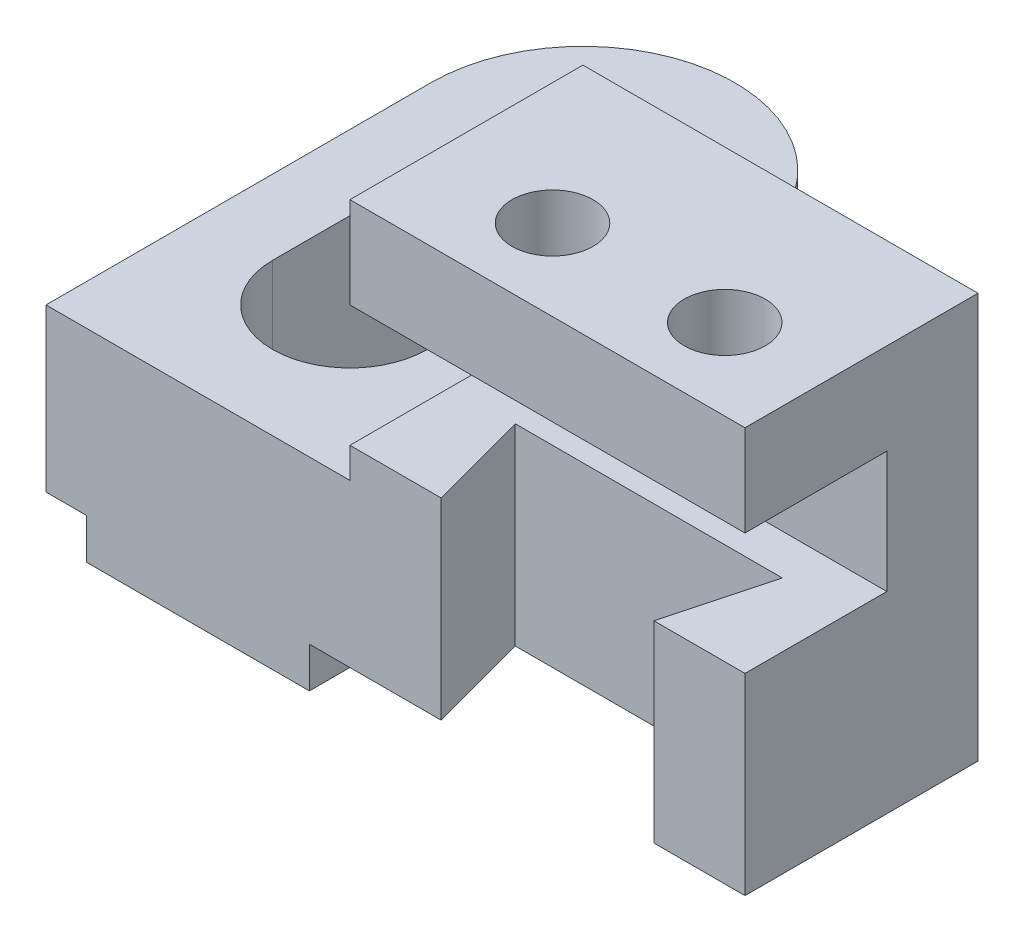
ISO-10303-21;
HEADER;
FILE_DESCRIPTION(('STEP AP214'),'2;1');
FILE_NAME('part.step','',(''),(''),'','','');
FILE_SCHEMA(('AUTOMOTIVE_DESIGN { 1 0 10303 214 1 1 1 1 }'));
ENDSEC;
DATA;
#1=APPLICATION_CONTEXT('core data for automotive mechanical design processes');
#2=APPLICATION_PROTOCOL_DEFINITION('international standard','automotive_design',2000,#1);
#3=PRODUCT_CONTEXT('',#1,'mechanical');
#4=PRODUCT('Part','Part','',(#3));
#5=PRODUCT_RELATED_PRODUCT_CATEGORY('part','',(#4));
#6=PRODUCT_DEFINITION_FORMATION('','',#4);
#7=PRODUCT_DEFINITION_CONTEXT('part definition',#1,'design');
#8=PRODUCT_DEFINITION('design','',#6,#7);
#9=PRODUCT_DEFINITION_SHAPE('','',#8);
#10=(LENGTH_UNIT() NAMED_UNIT(*) SI_UNIT(.MILLI.,.METRE.));
#11=(NAMED_UNIT(*) PLANE_ANGLE_UNIT() SI_UNIT($,.RADIAN.));
#12=(NAMED_UNIT(*) SI_UNIT($,.STERADIAN.) SOLID_ANGLE_UNIT());
#13=UNCERTAINTY_MEASURE_WITH_UNIT(LENGTH_MEASURE(1.E-05),#10,'distance_accuracy_value','');
#14=(GEOMETRIC_REPRESENTATION_CONTEXT(3) GLOBAL_UNCERTAINTY_ASSIGNED_CONTEXT((#13)) GLOBAL_UNIT_ASSIGNED_CONTEXT((#10,
#11,#12)) REPRESENTATION_CONTEXT('',''));
#15=CARTESIAN_POINT('',(0.,0.,0.));
#16=DIRECTION('',(0.,0.,1.));
#17=DIRECTION('',(1.,0.,0.));
#18=AXIS2_PLACEMENT_3D('',#15,#16,#17);
#19=CARTESIAN_POINT('',(0.,-16.,0.));
#20=DIRECTION('',(0.,1.,0.));
#21=DIRECTION('',(0.,0.,1.));
#22=AXIS2_PLACEMENT_3D('',#19,#20,#21);
#23=PLANE('',#22);
#24=DIRECTION('',(0.,0.,1.));
#25=VECTOR('',#24,1.);
#26=CARTESIAN_POINT('',(-7.63079742439027,-16.,0.));
#27=LINE('',#26,#25);
#28=CARTESIAN_POINT('',(-7.63079742439027,-16.,-43.4109870829268));
#29=VERTEX_POINT('',#28);
#30=CARTESIAN_POINT('',(-7.63079742439027,-16.,-20.4109870829268));
#31=VERTEX_POINT('',#30);
#32=EDGE_CURVE('E330',#29,#31,#27,.T.);
#33=ORIENTED_EDGE('',*,*,#32,.T.);
#34=CARTESIAN_POINT('',(0.,-16.,-20.4109870829268));
#35=DIRECTION('',(0.,1.,0.));
#36=DIRECTION('',(0.,0.,1.));
#37=AXIS2_PLACEMENT_3D('',#34,#35,#36);
#38=CIRCLE('',#37,7.63079742439027);
#39=CARTESIAN_POINT('',(7.63079742439027,-16.,-20.4109870829268));
#40=VERTEX_POINT('',#39);
#41=EDGE_CURVE('E339',#31,#40,#38,.T.);
#42=ORIENTED_EDGE('',*,*,#41,.T.);
#43=DIRECTION('',(0.,0.,1.));
#44=VECTOR('',#43,1.);
#45=CARTESIAN_POINT('',(7.63079742439027,-16.,0.));
#46=LINE('',#45,#44);
#47=CARTESIAN_POINT('',(7.63079742439027,-16.,-43.4109870829268));
#48=VERTEX_POINT('',#47);
#49=EDGE_CURVE('E336',#48,#40,#46,.T.);
#50=ORIENTED_EDGE('',*,*,#49,.F.);
#51=CARTESIAN_POINT('',(0.,-16.,-43.4109870829268));
#52=DIRECTION('',(0.,1.,0.));
#53=DIRECTION('',(0.,0.,1.));
#54=AXIS2_PLACEMENT_3D('',#51,#52,#53);
#55=CIRCLE('',#54,7.63079742439027);
#56=EDGE_CURVE('E333',#48,#29,#55,.T.);
#57=ORIENTED_EDGE('',*,*,#56,.T.);
#58=EDGE_LOOP('',(#33,#42,#50,#57));
#59=FACE_BOUND('',#58,.T.);
#60=DIRECTION('',(0.,0.,1.));
#61=VECTOR('',#60,1.);
#62=CARTESIAN_POINT('',(11.,-16.,-10.4109870829268));
#63=LINE('',#62,#61);
#64=CARTESIAN_POINT('',(11.,-16.,-10.4109870829268));
#65=VERTEX_POINT('',#64);
#66=CARTESIAN_POINT('',(11.,-16.,-5.41098708292683));
#67=VERTEX_POINT('',#66);
#68=EDGE_CURVE('E231',#65,#67,#63,.T.);
#69=ORIENTED_EDGE('',*,*,#68,.F.);
#70=DIRECTION('',(-1.,0.,0.));
#71=VECTOR('',#70,1.);
#72=CARTESIAN_POINT('',(-11.,-16.,-10.4109870829268));
#73=LINE('',#72,#71);
#74=CARTESIAN_POINT('',(-11.,-16.,-10.4109870829268));
#75=VERTEX_POINT('',#74);
#76=EDGE_CURVE('E208',#65,#75,#73,.T.);
#77=ORIENTED_EDGE('',*,*,#76,.T.);
#78=DIRECTION('',(0.,0.,1.));
#79=VECTOR('',#78,1.);
#80=CARTESIAN_POINT('',(-11.,-16.,-10.4109870829268));
#81=LINE('',#80,#79);
#82=CARTESIAN_POINT('',(-11.,-16.,-5.41098708292682));
#83=VERTEX_POINT('',#82);
#84=EDGE_CURVE('E220',#75,#83,#81,.T.);
#85=ORIENTED_EDGE('',*,*,#84,.T.);
#86=DIRECTION('',(1.,0.,0.));
#87=VECTOR('',#86,1.);
#88=CARTESIAN_POINT('',(0.,-16.,-5.41098708292683));
#89=LINE('',#88,#87);
#90=CARTESIAN_POINT('',(-15.,-16.,-5.41098708292682));
#91=VERTEX_POINT('',#90);
#92=EDGE_CURVE('E347',#91,#83,#89,.T.);
#93=ORIENTED_EDGE('',*,*,#92,.F.);
#94=DIRECTION('',(0.,0.,-1.));
#95=VECTOR('',#94,1.);
#96=CARTESIAN_POINT('',(-15.,-16.,0.));
#97=LINE('',#96,#95);
#98=CARTESIAN_POINT('',(-15.,-16.,-43.4109870829268));
#99=VERTEX_POINT('',#98);
#100=EDGE_CURVE('E344',#91,#99,#97,.T.);
#101=ORIENTED_EDGE('',*,*,#100,.T.);
#102=CARTESIAN_POINT('',(0.,-16.,-43.4109870829268));
#103=DIRECTION('',(0.,1.,0.));
#104=DIRECTION('',(0.,0.,1.));
#105=AXIS2_PLACEMENT_3D('',#102,#103,#104);
#106=CIRCLE('',#105,15.);
#107=CARTESIAN_POINT('',(15.,-16.,-43.4109870829268));
#108=VERTEX_POINT('',#107);
#109=EDGE_CURVE('E341',#99,#108,#106,.F.);
#110=ORIENTED_EDGE('',*,*,#109,.T.);
#111=DIRECTION('',(0.,0.,-1.));
#112=VECTOR('',#111,1.);
#113=CARTESIAN_POINT('',(15.,-16.,0.));
#114=LINE('',#113,#112);
#115=CARTESIAN_POINT('',(15.,-16.,-28.4109870829268));
#116=VERTEX_POINT('',#115);
#117=EDGE_CURVE('E350',#116,#108,#114,.T.);
#118=ORIENTED_EDGE('',*,*,#117,.F.);
#119=DIRECTION('',(1.,0.,0.));
#120=VECTOR('',#119,1.);
#121=CARTESIAN_POINT('',(54.,-16.,-28.4109870829268));
#122=LINE('',#121,#120);
#123=CARTESIAN_POINT('',(54.,-16.,-28.4109870829268));
#124=VERTEX_POINT('',#123);
#125=EDGE_CURVE('E320',#116,#124,#122,.T.);
#126=ORIENTED_EDGE('',*,*,#125,.T.);
#127=DIRECTION('',(0.,0.,1.));
#128=VECTOR('',#127,1.);
#129=CARTESIAN_POINT('',(54.,-16.,-28.4109870829268));
#130=LINE('',#129,#128);
#131=CARTESIAN_POINT('',(54.,-16.,-5.41098708292683));
#132=VERTEX_POINT('',#131);
#133=EDGE_CURVE('E325',#124,#132,#130,.T.);
#134=ORIENTED_EDGE('',*,*,#133,.T.);
#135=CARTESIAN_POINT('',(45.,-16.,-5.41098708292684));
#136=VERTEX_POINT('',#135);
#137=EDGE_CURVE('E346',#136,#132,#89,.T.);
#138=ORIENTED_EDGE('',*,*,#137,.F.);
#139=DIRECTION('',(-0.258819045102525,0.,0.965925826289067));
#140=VECTOR('',#139,1.);
#141=CARTESIAN_POINT('',(40.6328248144181,-16.,10.8875325952188));
#142=LINE('',#141,#140);
#143=CARTESIAN_POINT('',(47.6794919243113,-16.,-15.4109870829268));
#144=VERTEX_POINT('',#143);
#145=EDGE_CURVE('E254',#144,#136,#142,.T.);
#146=ORIENTED_EDGE('',*,*,#145,.F.);
#147=DIRECTION('',(1.,0.,0.));
#148=VECTOR('',#147,1.);
#149=CARTESIAN_POINT('',(0.,-16.,-15.4109870829268));
#150=LINE('',#149,#148);
#151=CARTESIAN_POINT('',(21.3205080756887,-16.,-15.4109870829268));
#152=VERTEX_POINT('',#151);
#153=EDGE_CURVE('E244',#152,#144,#150,.T.);
#154=ORIENTED_EDGE('',*,*,#153,.F.);
#155=DIRECTION('',(-0.258819045102525,0.,-0.965925826289067));
#156=VECTOR('',#155,1.);
#157=CARTESIAN_POINT('',(23.745051616145,-16.,-6.36246740478147));
#158=LINE('',#157,#156);
#159=CARTESIAN_POINT('',(24.,-16.,-5.41098708292683));
#160=VERTEX_POINT('',#159);
#161=EDGE_CURVE('E252',#160,#152,#158,.T.);
#162=ORIENTED_EDGE('',*,*,#161,.F.);
#163=EDGE_CURVE('E351',#67,#160,#89,.T.);
#164=ORIENTED_EDGE('',*,*,#163,.F.);
#165=EDGE_LOOP('',(#69,#77,#85,#93,#101,#110,#118,#126,#134,#138,#146,#154,#162,#164));
#166=FACE_BOUND('',#165,.T.);
#167=ADVANCED_FACE('F39',(#59,#166),#23,.F.);
#168=CARTESIAN_POINT('',(0.,-16.,-5.41098708292683));
#169=DIRECTION('',(0.,0.,1.));
#170=DIRECTION('',(1.,0.,0.));
#171=AXIS2_PLACEMENT_3D('',#168,#169,#170);
#172=PLANE('',#171);
#173=DIRECTION('',(-1.,0.,0.));
#174=VECTOR('',#173,1.);
#175=CARTESIAN_POINT('',(54.,3.,-5.41098708292684));
#176=LINE('',#175,#174);
#177=CARTESIAN_POINT('',(54.,3.,-5.41098708292684));
#178=VERTEX_POINT('',#177);
#179=CARTESIAN_POINT('',(45.,3.,-5.41098708292684));
#180=VERTEX_POINT('',#179);
#181=EDGE_CURVE('E298',#178,#180,#176,.T.);
#182=ORIENTED_EDGE('',*,*,#181,.T.);
#183=DIRECTION('',(0.,1.,0.));
#184=VECTOR('',#183,1.);
#185=CARTESIAN_POINT('',(45.,-20.,-5.41098708292684));
#186=LINE('',#185,#184);
#187=EDGE_CURVE('E242',#136,#180,#186,.T.);
#188=ORIENTED_EDGE('',*,*,#187,.F.);
#189=ORIENTED_EDGE('',*,*,#137,.T.);
#190=DIRECTION('',(0.,1.,0.));
#191=VECTOR('',#190,1.);
#192=CARTESIAN_POINT('',(54.,0.,-5.41098708292683));
#193=LINE('',#192,#191);
#194=EDGE_CURVE('E316',#132,#178,#193,.T.);
#195=ORIENTED_EDGE('',*,*,#194,.T.);
#196=EDGE_LOOP('',(#182,#188,#189,#195));
#197=FACE_BOUND('',#196,.T.);
#198=ADVANCED_FACE('F414',(#197),#172,.T.);
#199=ORIENTED_EDGE('',*,*,#92,.T.);
#200=DIRECTION('',(0.,-1.,0.));
#201=VECTOR('',#200,1.);
#202=CARTESIAN_POINT('',(-11.,-20.,-5.41098708292683));
#203=LINE('',#202,#201);
#204=CARTESIAN_POINT('',(-11.,-20.,-5.41098708292683));
#205=VERTEX_POINT('',#204);
#206=EDGE_CURVE('E56',#83,#205,#203,.T.);
#207=ORIENTED_EDGE('',*,*,#206,.T.);
#208=DIRECTION('',(1.,0.,0.));
#209=VECTOR('',#208,1.);
#210=CARTESIAN_POINT('',(11.,-20.,-5.41098708292683));
#211=LINE('',#210,#209);
#212=CARTESIAN_POINT('',(11.,-20.,-5.41098708292683));
#213=VERTEX_POINT('',#212);
#214=EDGE_CURVE('E205',#205,#213,#211,.T.);
#215=ORIENTED_EDGE('',*,*,#214,.T.);
#216=DIRECTION('',(0.,1.,0.));
#217=VECTOR('',#216,1.);
#218=CARTESIAN_POINT('',(11.,-16.,-5.41098708292683));
#219=LINE('',#218,#217);
#220=EDGE_CURVE('E221',#213,#67,#219,.T.);
#221=ORIENTED_EDGE('',*,*,#220,.T.);
#222=ORIENTED_EDGE('',*,*,#163,.T.);
#223=DIRECTION('',(0.,1.,0.));
#224=VECTOR('',#223,1.);
#225=CARTESIAN_POINT('',(24.,-20.,-5.41098708292683));
#226=LINE('',#225,#224);
#227=CARTESIAN_POINT('',(24.,3.,-5.41098708292683));
#228=VERTEX_POINT('',#227);
#229=EDGE_CURVE('E245',#160,#228,#226,.T.);
#230=ORIENTED_EDGE('',*,*,#229,.T.);
#231=CARTESIAN_POINT('',(15.,3.,-5.41098708292683));
#232=VERTEX_POINT('',#231);
#233=EDGE_CURVE('E281',#228,#232,#176,.T.);
#234=ORIENTED_EDGE('',*,*,#233,.T.);
#235=DIRECTION('',(0.,-1.,0.));
#236=VECTOR('',#235,1.);
#237=CARTESIAN_POINT('',(15.,3.,-5.41098708292683));
#238=LINE('',#237,#236);
#239=CARTESIAN_POINT('',(15.,0.,-5.41098708292683));
#240=VERTEX_POINT('',#239);
#241=EDGE_CURVE('E272',#232,#240,#238,.T.);
#242=ORIENTED_EDGE('',*,*,#241,.T.);
#243=DIRECTION('',(1.,0.,0.));
#244=VECTOR('',#243,1.);
#245=CARTESIAN_POINT('',(0.,0.,-5.41098708292683));
#246=LINE('',#245,#244);
#247=CARTESIAN_POINT('',(-15.,0.,-5.41098708292682));
#248=VERTEX_POINT('',#247);
#249=EDGE_CURVE('E368',#248,#240,#246,.T.);
#250=ORIENTED_EDGE('',*,*,#249,.F.);
#251=DIRECTION('',(0.,1.,0.));
#252=VECTOR('',#251,1.);
#253=CARTESIAN_POINT('',(-15.,-16.,-5.41098708292682));
#254=LINE('',#253,#252);
#255=EDGE_CURVE('E48',#91,#248,#254,.T.);
#256=ORIENTED_EDGE('',*,*,#255,.F.);
#257=EDGE_LOOP('',(#199,#207,#215,#221,#222,#230,#234,#242,#250,#256));
#258=FACE_BOUND('',#257,.T.);
#259=ADVANCED_FACE('F419',(#258),#172,.T.);
#260=CARTESIAN_POINT('',(54.,3.,-19.4109870829268));
#261=DIRECTION('',(0.,-1.,0.));
#262=DIRECTION('',(0.,0.,-1.));
#263=AXIS2_PLACEMENT_3D('',#260,#261,#262);
#264=PLANE('',#263);
#265=DIRECTION('',(-0.258819045102525,0.,0.965925826289067));
#266=VECTOR('',#265,1.);
#267=CARTESIAN_POINT('',(40.632824814418,3.,10.8875325952188));
#268=LINE('',#267,#266);
#269=CARTESIAN_POINT('',(47.6794919243113,3.,-15.4109870829268));
#270=VERTEX_POINT('',#269);
#271=EDGE_CURVE('E64',#270,#180,#268,.T.);
#272=ORIENTED_EDGE('',*,*,#271,.T.);
#273=ORIENTED_EDGE('',*,*,#181,.F.);
#274=DIRECTION('',(0.,0.,1.));
#275=VECTOR('',#274,1.);
#276=CARTESIAN_POINT('',(54.,3.,-19.4109870829268));
#277=LINE('',#276,#275);
#278=CARTESIAN_POINT('',(54.,3.,-19.4109870829268));
#279=VERTEX_POINT('',#278);
#280=EDGE_CURVE('E278',#279,#178,#277,.T.);
#281=ORIENTED_EDGE('',*,*,#280,.F.);
#282=DIRECTION('',(-1.,0.,0.));
#283=VECTOR('',#282,1.);
#284=CARTESIAN_POINT('',(54.,3.,-19.4109870829268));
#285=LINE('',#284,#283);
#286=CARTESIAN_POINT('',(15.,3.,-19.4109870829268));
#287=VERTEX_POINT('',#286);
#288=EDGE_CURVE('E301',#279,#287,#285,.T.);
#289=ORIENTED_EDGE('',*,*,#288,.T.);
#290=DIRECTION('',(0.,0.,1.));
#291=VECTOR('',#290,1.);
#292=CARTESIAN_POINT('',(15.,3.,-19.4109870829268));
#293=LINE('',#292,#291);
#294=EDGE_CURVE('E294',#287,#232,#293,.T.);
#295=ORIENTED_EDGE('',*,*,#294,.T.);
#296=ORIENTED_EDGE('',*,*,#233,.F.);
#297=DIRECTION('',(-0.258819045102525,0.,-0.965925826289067));
#298=VECTOR('',#297,1.);
#299=CARTESIAN_POINT('',(23.745051616145,3.,-6.36246740478147));
#300=LINE('',#299,#298);
#301=CARTESIAN_POINT('',(21.3205080756887,3.,-15.4109870829268));
#302=VERTEX_POINT('',#301);
#303=EDGE_CURVE('E238',#228,#302,#300,.T.);
#304=ORIENTED_EDGE('',*,*,#303,.T.);
#305=DIRECTION('',(1.,0.,0.));
#306=VECTOR('',#305,1.);
#307=CARTESIAN_POINT('',(0.,3.,-15.4109870829268));
#308=LINE('',#307,#306);
#309=EDGE_CURVE('E235',#302,#270,#308,.T.);
#310=ORIENTED_EDGE('',*,*,#309,.T.);
#311=EDGE_LOOP('',(#272,#273,#281,#289,#295,#296,#304,#310));
#312=FACE_BOUND('',#311,.T.);
#313=ADVANCED_FACE('F428',(#312),#264,.F.);
#314=CARTESIAN_POINT('',(0.,0.,0.));
#315=DIRECTION('',(0.,1.,0.));
#316=DIRECTION('',(0.,0.,1.));
#317=AXIS2_PLACEMENT_3D('',#314,#315,#316);
#318=PLANE('',#317);
#319=DIRECTION('',(0.,0.,1.));
#320=VECTOR('',#319,1.);
#321=CARTESIAN_POINT('',(-7.63079742439027,0.,0.));
#322=LINE('',#321,#320);
#323=CARTESIAN_POINT('',(-7.63079742439027,0.,-43.4109870829268));
#324=VERTEX_POINT('',#323);
#325=CARTESIAN_POINT('',(-7.63079742439027,0.,-20.4109870829268));
#326=VERTEX_POINT('',#325);
#327=EDGE_CURVE('E329',#324,#326,#322,.T.);
#328=ORIENTED_EDGE('',*,*,#327,.F.);
#329=CARTESIAN_POINT('',(0.,0.,-43.4109870829268));
#330=DIRECTION('',(0.,1.,0.));
#331=DIRECTION('',(0.,0.,1.));
#332=AXIS2_PLACEMENT_3D('',#329,#330,#331);
#333=CIRCLE('',#332,7.63079742439027);
#334=CARTESIAN_POINT('',(7.63079742439027,0.,-43.4109870829268));
#335=VERTEX_POINT('',#334);
#336=EDGE_CURVE('E355',#335,#324,#333,.T.);
#337=ORIENTED_EDGE('',*,*,#336,.F.);
#338=DIRECTION('',(0.,0.,1.));
#339=VECTOR('',#338,1.);
#340=CARTESIAN_POINT('',(7.63079742439027,0.,0.));
#341=LINE('',#340,#339);
#342=CARTESIAN_POINT('',(7.63079742439027,0.,-20.4109870829268));
#343=VERTEX_POINT('',#342);
#344=EDGE_CURVE('E357',#335,#343,#341,.T.);
#345=ORIENTED_EDGE('',*,*,#344,.T.);
#346=CARTESIAN_POINT('',(0.,0.,-20.4109870829268));
#347=DIRECTION('',(0.,1.,0.));
#348=DIRECTION('',(0.,0.,1.));
#349=AXIS2_PLACEMENT_3D('',#346,#347,#348);
#350=CIRCLE('',#349,7.63079742439027);
#351=EDGE_CURVE('E360',#326,#343,#350,.T.);
#352=ORIENTED_EDGE('',*,*,#351,.F.);
#353=EDGE_LOOP('',(#328,#337,#345,#352));
#354=FACE_BOUND('',#353,.T.);
#355=ORIENTED_EDGE('',*,*,#249,.T.);
#356=DIRECTION('',(0.,0.,-1.));
#357=VECTOR('',#356,1.);
#358=CARTESIAN_POINT('',(15.,0.,-28.4109870829268));
#359=LINE('',#358,#357);
#360=CARTESIAN_POINT('',(15.,0.,-28.4109870829268));
#361=VERTEX_POINT('',#360);
#362=EDGE_CURVE('E260',#240,#361,#359,.T.);
#363=ORIENTED_EDGE('',*,*,#362,.T.);
#364=DIRECTION('',(0.,0.,-1.));
#365=VECTOR('',#364,1.);
#366=CARTESIAN_POINT('',(15.,0.,0.));
#367=LINE('',#366,#365);
#368=CARTESIAN_POINT('',(15.,0.,-43.4109870829268));
#369=VERTEX_POINT('',#368);
#370=EDGE_CURVE('E334',#361,#369,#367,.T.);
#371=ORIENTED_EDGE('',*,*,#370,.T.);
#372=CARTESIAN_POINT('',(0.,0.,-43.4109870829268));
#373=DIRECTION('',(0.,1.,0.));
#374=DIRECTION('',(0.,0.,1.));
#375=AXIS2_PLACEMENT_3D('',#372,#373,#374);
#376=CIRCLE('',#375,15.);
#377=CARTESIAN_POINT('',(-15.,0.,-43.4109870829268));
#378=VERTEX_POINT('',#377);
#379=EDGE_CURVE('E363',#378,#369,#376,.F.);
#380=ORIENTED_EDGE('',*,*,#379,.F.);
#381=DIRECTION('',(0.,0.,-1.));
#382=VECTOR('',#381,1.);
#383=CARTESIAN_POINT('',(-15.,0.,0.));
#384=LINE('',#383,#382);
#385=EDGE_CURVE('E366',#248,#378,#384,.T.);
#386=ORIENTED_EDGE('',*,*,#385,.F.);
#387=EDGE_LOOP('',(#355,#363,#371,#380,#386));
#388=FACE_BOUND('',#387,.T.);
#389=ADVANCED_FACE('F391',(#354,#388),#318,.T.);
#390=CARTESIAN_POINT('',(0.,-16.,-43.4109870829268));
#391=DIRECTION('',(0.,1.,0.));
#392=DIRECTION('',(0.,0.,1.));
#393=AXIS2_PLACEMENT_3D('',#390,#391,#392);
#394=CYLINDRICAL_SURFACE('',#393,15.);
#395=ORIENTED_EDGE('',*,*,#379,.T.);
#396=DIRECTION('',(0.,1.,0.));
#397=VECTOR('',#396,1.);
#398=CARTESIAN_POINT('',(15.,-16.,-43.4109870829268));
#399=LINE('',#398,#397);
#400=EDGE_CURVE('E11',#108,#369,#399,.T.);
#401=ORIENTED_EDGE('',*,*,#400,.F.);
#402=ORIENTED_EDGE('',*,*,#109,.F.);
#403=DIRECTION('',(0.,1.,0.));
#404=VECTOR('',#403,1.);
#405=CARTESIAN_POINT('',(-15.,-16.,-43.4109870829268));
#406=LINE('',#405,#404);
#407=EDGE_CURVE('E373',#99,#378,#406,.T.);
#408=ORIENTED_EDGE('',*,*,#407,.T.);
#409=EDGE_LOOP('',(#395,#401,#402,#408));
#410=FACE_BOUND('',#409,.T.);
#411=ADVANCED_FACE('F427',(#410),#394,.T.);
#412=CARTESIAN_POINT('',(15.,-16.,0.));
#413=DIRECTION('',(1.,0.,0.));
#414=DIRECTION('',(0.,0.,-1.));
#415=AXIS2_PLACEMENT_3D('',#412,#413,#414);
#416=PLANE('',#415);
#417=DIRECTION('',(0.,-1.,0.));
#418=VECTOR('',#417,1.);
#419=CARTESIAN_POINT('',(15.,-16.,-28.4109870829268));
#420=LINE('',#419,#418);
#421=EDGE_CURVE('E317',#361,#116,#420,.T.);
#422=ORIENTED_EDGE('',*,*,#421,.T.);
#423=ORIENTED_EDGE('',*,*,#117,.T.);
#424=ORIENTED_EDGE('',*,*,#400,.T.);
#425=ORIENTED_EDGE('',*,*,#370,.F.);
#426=EDGE_LOOP('',(#422,#423,#424,#425));
#427=FACE_BOUND('',#426,.T.);
#428=ADVANCED_FACE('F429',(#427),#416,.T.);
#429=CARTESIAN_POINT('',(-7.63079742439027,-16.,0.));
#430=DIRECTION('',(-1.,0.,0.));
#431=DIRECTION('',(0.,0.,1.));
#432=AXIS2_PLACEMENT_3D('',#429,#430,#431);
#433=PLANE('',#432);
#434=ORIENTED_EDGE('',*,*,#327,.T.);
#435=DIRECTION('',(0.,1.,0.));
#436=VECTOR('',#435,1.);
#437=CARTESIAN_POINT('',(-7.63079742439027,-16.,-20.4109870829268));
#438=LINE('',#437,#436);
#439=EDGE_CURVE('E376',#31,#326,#438,.T.);
#440=ORIENTED_EDGE('',*,*,#439,.F.);
#441=ORIENTED_EDGE('',*,*,#32,.F.);
#442=DIRECTION('',(0.,1.,0.));
#443=VECTOR('',#442,1.);
#444=CARTESIAN_POINT('',(-7.63079742439027,-16.,-43.4109870829268));
#445=LINE('',#444,#443);
#446=EDGE_CURVE('E43',#29,#324,#445,.T.);
#447=ORIENTED_EDGE('',*,*,#446,.T.);
#448=EDGE_LOOP('',(#434,#440,#441,#447));
#449=FACE_BOUND('',#448,.T.);
#450=ADVANCED_FACE('F41',(#449),#433,.F.);
#451=CARTESIAN_POINT('',(0.,-16.,-20.4109870829268));
#452=DIRECTION('',(0.,1.,0.));
#453=DIRECTION('',(0.,0.,1.));
#454=AXIS2_PLACEMENT_3D('',#451,#452,#453);
#455=CYLINDRICAL_SURFACE('',#454,7.63079742439027);
#456=ORIENTED_EDGE('',*,*,#351,.T.);
#457=DIRECTION('',(0.,1.,0.));
#458=VECTOR('',#457,1.);
#459=CARTESIAN_POINT('',(7.63079742439027,-16.,-20.4109870829268));
#460=LINE('',#459,#458);
#461=EDGE_CURVE('E379',#40,#343,#460,.T.);
#462=ORIENTED_EDGE('',*,*,#461,.F.);
#463=ORIENTED_EDGE('',*,*,#41,.F.);
#464=ORIENTED_EDGE('',*,*,#439,.T.);
#465=EDGE_LOOP('',(#456,#462,#463,#464));
#466=FACE_BOUND('',#465,.T.);
#467=ADVANCED_FACE('F396',(#466),#455,.F.);
#468=CARTESIAN_POINT('',(7.63079742439027,-16.,0.));
#469=DIRECTION('',(-1.,0.,0.));
#470=DIRECTION('',(0.,0.,1.));
#471=AXIS2_PLACEMENT_3D('',#468,#469,#470);
#472=PLANE('',#471);
#473=ORIENTED_EDGE('',*,*,#344,.F.);
#474=DIRECTION('',(0.,1.,0.));
#475=VECTOR('',#474,1.);
#476=CARTESIAN_POINT('',(7.63079742439027,-16.,-43.4109870829268));
#477=LINE('',#476,#475);
#478=EDGE_CURVE('E380',#48,#335,#477,.T.);
#479=ORIENTED_EDGE('',*,*,#478,.F.);
#480=ORIENTED_EDGE('',*,*,#49,.T.);
#481=ORIENTED_EDGE('',*,*,#461,.T.);
#482=EDGE_LOOP('',(#473,#479,#480,#481));
#483=FACE_BOUND('',#482,.T.);
#484=ADVANCED_FACE('F403',(#483),#472,.T.);
#485=CARTESIAN_POINT('',(0.,-16.,-43.4109870829268));
#486=DIRECTION('',(0.,1.,0.));
#487=DIRECTION('',(0.,0.,1.));
#488=AXIS2_PLACEMENT_3D('',#485,#486,#487);
#489=CYLINDRICAL_SURFACE('',#488,7.63079742439027);
#490=ORIENTED_EDGE('',*,*,#336,.T.);
#491=ORIENTED_EDGE('',*,*,#446,.F.);
#492=ORIENTED_EDGE('',*,*,#56,.F.);
#493=ORIENTED_EDGE('',*,*,#478,.T.);
#494=EDGE_LOOP('',(#490,#491,#492,#493));
#495=FACE_BOUND('',#494,.T.);
#496=ADVANCED_FACE('F400',(#495),#489,.F.);
#497=CARTESIAN_POINT('',(-15.,-16.,0.));
#498=DIRECTION('',(1.,0.,0.));
#499=DIRECTION('',(0.,0.,-1.));
#500=AXIS2_PLACEMENT_3D('',#497,#498,#499);
#501=PLANE('',#500);
#502=ORIENTED_EDGE('',*,*,#385,.T.);
#503=ORIENTED_EDGE('',*,*,#407,.F.);
#504=ORIENTED_EDGE('',*,*,#100,.F.);
#505=ORIENTED_EDGE('',*,*,#255,.T.);
#506=EDGE_LOOP('',(#502,#503,#504,#505));
#507=FACE_BOUND('',#506,.T.);
#508=ADVANCED_FACE('F402',(#507),#501,.F.);
#509=CARTESIAN_POINT('',(54.,0.,-28.4109870829268));
#510=DIRECTION('',(1.,0.,0.));
#511=DIRECTION('',(0.,0.,-1.));
#512=AXIS2_PLACEMENT_3D('',#509,#510,#511);
#513=PLANE('',#512);
#514=ORIENTED_EDGE('',*,*,#194,.F.);
#515=ORIENTED_EDGE('',*,*,#133,.F.);
#516=DIRECTION('',(0.,1.,0.));
#517=VECTOR('',#516,1.);
#518=CARTESIAN_POINT('',(54.,0.,-28.4109870829268));
#519=LINE('',#518,#517);
#520=CARTESIAN_POINT('',(54.,24.,-28.4109870829268));
#521=VERTEX_POINT('',#520);
#522=EDGE_CURVE('E323',#124,#521,#519,.T.);
#523=ORIENTED_EDGE('',*,*,#522,.T.);
#524=DIRECTION('',(0.,0.,1.));
#525=VECTOR('',#524,1.);
#526=CARTESIAN_POINT('',(54.,24.,-5.41098708292684));
#527=LINE('',#526,#525);
#528=CARTESIAN_POINT('',(54.,24.,-5.41098708292684));
#529=VERTEX_POINT('',#528);
#530=EDGE_CURVE('E269',#521,#529,#527,.T.);
#531=ORIENTED_EDGE('',*,*,#530,.T.);
#532=DIRECTION('',(0.,-1.,0.));
#533=VECTOR('',#532,1.);
#534=CARTESIAN_POINT('',(54.,24.,-5.41098708292684));
#535=LINE('',#534,#533);
#536=CARTESIAN_POINT('',(54.,15.,-5.41098708292684));
#537=VERTEX_POINT('',#536);
#538=EDGE_CURVE('E271',#529,#537,#535,.T.);
#539=ORIENTED_EDGE('',*,*,#538,.T.);
#540=DIRECTION('',(0.,0.,-1.));
#541=VECTOR('',#540,1.);
#542=CARTESIAN_POINT('',(54.,15.,-5.41098708292684));
#543=LINE('',#542,#541);
#544=CARTESIAN_POINT('',(54.,15.,-19.4109870829268));
#545=VERTEX_POINT('',#544);
#546=EDGE_CURVE('E274',#537,#545,#543,.T.);
#547=ORIENTED_EDGE('',*,*,#546,.T.);
#548=DIRECTION('',(0.,-1.,0.));
#549=VECTOR('',#548,1.);
#550=CARTESIAN_POINT('',(54.,15.,-19.4109870829268));
#551=LINE('',#550,#549);
#552=EDGE_CURVE('E276',#545,#279,#551,.T.);
#553=ORIENTED_EDGE('',*,*,#552,.T.);
#554=ORIENTED_EDGE('',*,*,#280,.T.);
#555=EDGE_LOOP('',(#514,#515,#523,#531,#539,#547,#553,#554));
#556=FACE_BOUND('',#555,.T.);
#557=ADVANCED_FACE('F408',(#556),#513,.T.);
#558=CARTESIAN_POINT('',(0.,0.,-28.4109870829268));
#559=DIRECTION('',(0.,0.,-1.));
#560=DIRECTION('',(-1.,0.,0.));
#561=AXIS2_PLACEMENT_3D('',#558,#559,#560);
#562=PLANE('',#561);
#563=ORIENTED_EDGE('',*,*,#421,.F.);
#564=DIRECTION('',(0.,1.,0.));
#565=VECTOR('',#564,1.);
#566=CARTESIAN_POINT('',(15.,24.,-28.4109870829268));
#567=LINE('',#566,#565);
#568=CARTESIAN_POINT('',(15.,24.,-28.4109870829268));
#569=VERTEX_POINT('',#568);
#570=EDGE_CURVE('E284',#361,#569,#567,.T.);
#571=ORIENTED_EDGE('',*,*,#570,.T.);
#572=DIRECTION('',(-1.,0.,0.));
#573=VECTOR('',#572,1.);
#574=CARTESIAN_POINT('',(54.,24.,-28.4109870829268));
#575=LINE('',#574,#573);
#576=EDGE_CURVE('E313',#521,#569,#575,.T.);
#577=ORIENTED_EDGE('',*,*,#576,.F.);
#578=ORIENTED_EDGE('',*,*,#522,.F.);
#579=ORIENTED_EDGE('',*,*,#125,.F.);
#580=EDGE_LOOP('',(#563,#571,#577,#578,#579));
#581=FACE_BOUND('',#580,.T.);
#582=ADVANCED_FACE('F550',(#581),#562,.T.);
#583=CARTESIAN_POINT('',(54.,24.,-5.41098708292684));
#584=DIRECTION('',(0.,-1.,0.));
#585=DIRECTION('',(0.,0.,-1.));
#586=AXIS2_PLACEMENT_3D('',#583,#584,#585);
#587=PLANE('',#586);
#588=CARTESIAN_POINT('',(27.,24.,-13.4109870829268));
#589=DIRECTION('',(0.,1.,0.));
#590=DIRECTION('',(0.,0.,1.));
#591=AXIS2_PLACEMENT_3D('',#588,#589,#590);
#592=CIRCLE('',#591,4.);
#593=CARTESIAN_POINT('',(27.,24.,-9.41098708292684));
#594=VERTEX_POINT('',#593);
#595=EDGE_CURVE('E261',#594,#594,#592,.T.);
#596=ORIENTED_EDGE('',*,*,#595,.F.);
#597=EDGE_LOOP('',(#596));
#598=FACE_BOUND('',#597,.T.);
#599=CARTESIAN_POINT('',(44.,24.,-13.4109870829268));
#600=DIRECTION('',(0.,1.,0.));
#601=DIRECTION('',(0.,0.,1.));
#602=AXIS2_PLACEMENT_3D('',#599,#600,#601);
#603=CIRCLE('',#602,4.);
#604=CARTESIAN_POINT('',(44.,24.,-9.41098708292684));
#605=VERTEX_POINT('',#604);
#606=EDGE_CURVE('E264',#605,#605,#603,.T.);
#607=ORIENTED_EDGE('',*,*,#606,.F.);
#608=EDGE_LOOP('',(#607));
#609=FACE_BOUND('',#608,.T.);
#610=DIRECTION('',(0.,0.,1.));
#611=VECTOR('',#610,1.);
#612=CARTESIAN_POINT('',(15.,24.,-5.41098708292683));
#613=LINE('',#612,#611);
#614=CARTESIAN_POINT('',(15.,24.,-5.41098708292683));
#615=VERTEX_POINT('',#614);
#616=EDGE_CURVE('E286',#569,#615,#613,.T.);
#617=ORIENTED_EDGE('',*,*,#616,.T.);
#618=DIRECTION('',(-1.,0.,0.));
#619=VECTOR('',#618,1.);
#620=CARTESIAN_POINT('',(54.,24.,-5.41098708292684));
#621=LINE('',#620,#619);
#622=EDGE_CURVE('E310',#529,#615,#621,.T.);
#623=ORIENTED_EDGE('',*,*,#622,.F.);
#624=ORIENTED_EDGE('',*,*,#530,.F.);
#625=ORIENTED_EDGE('',*,*,#576,.T.);
#626=EDGE_LOOP('',(#617,#623,#624,#625));
#627=FACE_BOUND('',#626,.T.);
#628=ADVANCED_FACE('F540',(#598,#609,#627),#587,.F.);
#629=CARTESIAN_POINT('',(54.,24.,-5.41098708292684));
#630=DIRECTION('',(0.,0.,-1.));
#631=DIRECTION('',(-1.,0.,0.));
#632=AXIS2_PLACEMENT_3D('',#629,#630,#631);
#633=PLANE('',#632);
#634=DIRECTION('',(0.,-1.,0.));
#635=VECTOR('',#634,1.);
#636=CARTESIAN_POINT('',(15.,24.,-5.41098708292683));
#637=LINE('',#636,#635);
#638=CARTESIAN_POINT('',(15.,15.,-5.41098708292683));
#639=VERTEX_POINT('',#638);
#640=EDGE_CURVE('E288',#615,#639,#637,.T.);
#641=ORIENTED_EDGE('',*,*,#640,.T.);
#642=DIRECTION('',(-1.,0.,0.));
#643=VECTOR('',#642,1.);
#644=CARTESIAN_POINT('',(54.,15.,-5.41098708292684));
#645=LINE('',#644,#643);
#646=EDGE_CURVE('E307',#537,#639,#645,.T.);
#647=ORIENTED_EDGE('',*,*,#646,.F.);
#648=ORIENTED_EDGE('',*,*,#538,.F.);
#649=ORIENTED_EDGE('',*,*,#622,.T.);
#650=EDGE_LOOP('',(#641,#647,#648,#649));
#651=FACE_BOUND('',#650,.T.);
#652=ADVANCED_FACE('F530',(#651),#633,.F.);
#653=CARTESIAN_POINT('',(54.,15.,-5.41098708292684));
#654=DIRECTION('',(0.,1.,0.));
#655=DIRECTION('',(0.,0.,1.));
#656=AXIS2_PLACEMENT_3D('',#653,#654,#655);
#657=PLANE('',#656);
#658=CARTESIAN_POINT('',(27.,15.,-13.4109870829268));
#659=DIRECTION('',(0.,1.,0.));
#660=DIRECTION('',(0.,0.,1.));
#661=AXIS2_PLACEMENT_3D('',#658,#659,#660);
#662=CIRCLE('',#661,4.);
#663=CARTESIAN_POINT('',(27.,15.,-9.41098708292684));
#664=VERTEX_POINT('',#663);
#665=EDGE_CURVE('E257',#664,#664,#662,.T.);
#666=ORIENTED_EDGE('',*,*,#665,.T.);
#667=EDGE_LOOP('',(#666));
#668=FACE_BOUND('',#667,.T.);
#669=CARTESIAN_POINT('',(44.,15.,-13.4109870829268));
#670=DIRECTION('',(0.,1.,0.));
#671=DIRECTION('',(0.,0.,1.));
#672=AXIS2_PLACEMENT_3D('',#669,#670,#671);
#673=CIRCLE('',#672,4.);
#674=CARTESIAN_POINT('',(44.,15.,-9.41098708292684));
#675=VERTEX_POINT('',#674);
#676=EDGE_CURVE('E256',#675,#675,#673,.T.);
#677=ORIENTED_EDGE('',*,*,#676,.T.);
#678=EDGE_LOOP('',(#677));
#679=FACE_BOUND('',#678,.T.);
#680=DIRECTION('',(0.,0.,-1.));
#681=VECTOR('',#680,1.);
#682=CARTESIAN_POINT('',(15.,15.,-5.41098708292683));
#683=LINE('',#682,#681);
#684=CARTESIAN_POINT('',(15.,15.,-19.4109870829268));
#685=VERTEX_POINT('',#684);
#686=EDGE_CURVE('E290',#639,#685,#683,.T.);
#687=ORIENTED_EDGE('',*,*,#686,.T.);
#688=DIRECTION('',(-1.,0.,0.));
#689=VECTOR('',#688,1.);
#690=CARTESIAN_POINT('',(54.,15.,-19.4109870829268));
#691=LINE('',#690,#689);
#692=EDGE_CURVE('E304',#545,#685,#691,.T.);
#693=ORIENTED_EDGE('',*,*,#692,.F.);
#694=ORIENTED_EDGE('',*,*,#546,.F.);
#695=ORIENTED_EDGE('',*,*,#646,.T.);
#696=EDGE_LOOP('',(#687,#693,#694,#695));
#697=FACE_BOUND('',#696,.T.);
#698=ADVANCED_FACE('F520',(#668,#679,#697),#657,.F.);
#699=CARTESIAN_POINT('',(54.,15.,-19.4109870829268));
#700=DIRECTION('',(0.,0.,-1.));
#701=DIRECTION('',(-1.,0.,0.));
#702=AXIS2_PLACEMENT_3D('',#699,#700,#701);
#703=PLANE('',#702);
#704=DIRECTION('',(0.,-1.,0.));
#705=VECTOR('',#704,1.);
#706=CARTESIAN_POINT('',(15.,15.,-19.4109870829268));
#707=LINE('',#706,#705);
#708=EDGE_CURVE('E292',#685,#287,#707,.T.);
#709=ORIENTED_EDGE('',*,*,#708,.T.);
#710=ORIENTED_EDGE('',*,*,#288,.F.);
#711=ORIENTED_EDGE('',*,*,#552,.F.);
#712=ORIENTED_EDGE('',*,*,#692,.T.);
#713=EDGE_LOOP('',(#709,#710,#711,#712));
#714=FACE_BOUND('',#713,.T.);
#715=ADVANCED_FACE('F510',(#714),#703,.F.);
#716=CARTESIAN_POINT('',(15.,0.,0.));
#717=DIRECTION('',(1.,0.,0.));
#718=DIRECTION('',(0.,0.,-1.));
#719=AXIS2_PLACEMENT_3D('',#716,#717,#718);
#720=PLANE('',#719);
#721=ORIENTED_EDGE('',*,*,#362,.F.);
#722=ORIENTED_EDGE('',*,*,#241,.F.);
#723=ORIENTED_EDGE('',*,*,#294,.F.);
#724=ORIENTED_EDGE('',*,*,#708,.F.);
#725=ORIENTED_EDGE('',*,*,#686,.F.);
#726=ORIENTED_EDGE('',*,*,#640,.F.);
#727=ORIENTED_EDGE('',*,*,#616,.F.);
#728=ORIENTED_EDGE('',*,*,#570,.F.);
#729=EDGE_LOOP('',(#721,#722,#723,#724,#725,#726,#727,#728));
#730=FACE_BOUND('',#729,.T.);
#731=ADVANCED_FACE('F500',(#730),#720,.F.);
#732=CARTESIAN_POINT('',(44.,15.,-13.4109870829268));
#733=DIRECTION('',(0.,1.,0.));
#734=DIRECTION('',(0.,0.,1.));
#735=AXIS2_PLACEMENT_3D('',#732,#733,#734);
#736=CYLINDRICAL_SURFACE('',#735,4.);
#737=ORIENTED_EDGE('',*,*,#676,.F.);
#738=EDGE_LOOP('',(#737));
#739=FACE_BOUND('',#738,.T.);
#740=ORIENTED_EDGE('',*,*,#606,.T.);
#741=EDGE_LOOP('',(#740));
#742=FACE_BOUND('',#741,.T.);
#743=ADVANCED_FACE('F488',(#739,#742),#736,.F.);
#744=CARTESIAN_POINT('',(27.,15.,-13.4109870829268));
#745=DIRECTION('',(0.,1.,0.));
#746=DIRECTION('',(0.,0.,1.));
#747=AXIS2_PLACEMENT_3D('',#744,#745,#746);
#748=CYLINDRICAL_SURFACE('',#747,4.);
#749=ORIENTED_EDGE('',*,*,#665,.F.);
#750=EDGE_LOOP('',(#749));
#751=FACE_BOUND('',#750,.T.);
#752=ORIENTED_EDGE('',*,*,#595,.T.);
#753=EDGE_LOOP('',(#752));
#754=FACE_BOUND('',#753,.T.);
#755=ADVANCED_FACE('F482',(#751,#754),#748,.F.);
#756=CARTESIAN_POINT('',(40.632824814418,-20.,10.8875325952188));
#757=DIRECTION('',(-0.965925826289067,0.,-0.258819045102525));
#758=DIRECTION('',(-0.258819045102525,0.,0.965925826289067));
#759=AXIS2_PLACEMENT_3D('',#756,#757,#758);
#760=PLANE('',#759);
#761=ORIENTED_EDGE('',*,*,#145,.T.);
#762=ORIENTED_EDGE('',*,*,#187,.T.);
#763=ORIENTED_EDGE('',*,*,#271,.F.);
#764=DIRECTION('',(0.,1.,0.));
#765=VECTOR('',#764,1.);
#766=CARTESIAN_POINT('',(47.6794919243113,-20.,-15.4109870829268));
#767=LINE('',#766,#765);
#768=EDGE_CURVE('E241',#144,#270,#767,.T.);
#769=ORIENTED_EDGE('',*,*,#768,.F.);
#770=EDGE_LOOP('',(#761,#762,#763,#769));
#771=FACE_BOUND('',#770,.T.);
#772=ADVANCED_FACE('F487',(#771),#760,.T.);
#773=CARTESIAN_POINT('',(23.745051616145,-20.,-6.36246740478147));
#774=DIRECTION('',(0.965925826289067,0.,-0.258819045102525));
#775=DIRECTION('',(-0.258819045102525,0.,-0.965925826289067));
#776=AXIS2_PLACEMENT_3D('',#773,#774,#775);
#777=PLANE('',#776);
#778=ORIENTED_EDGE('',*,*,#161,.T.);
#779=DIRECTION('',(0.,1.,0.));
#780=VECTOR('',#779,1.);
#781=CARTESIAN_POINT('',(21.3205080756887,-20.,-15.4109870829268));
#782=LINE('',#781,#780);
#783=EDGE_CURVE('E248',#152,#302,#782,.T.);
#784=ORIENTED_EDGE('',*,*,#783,.T.);
#785=ORIENTED_EDGE('',*,*,#303,.F.);
#786=ORIENTED_EDGE('',*,*,#229,.F.);
#787=EDGE_LOOP('',(#778,#784,#785,#786));
#788=FACE_BOUND('',#787,.T.);
#789=ADVANCED_FACE('F704',(#788),#777,.T.);
#790=CARTESIAN_POINT('',(0.,-20.,-15.4109870829268));
#791=DIRECTION('',(0.,0.,1.));
#792=DIRECTION('',(0.,-1.,0.));
#793=AXIS2_PLACEMENT_3D('',#790,#791,#792);
#794=PLANE('',#793);
#795=ORIENTED_EDGE('',*,*,#153,.T.);
#796=ORIENTED_EDGE('',*,*,#768,.T.);
#797=ORIENTED_EDGE('',*,*,#309,.F.);
#798=ORIENTED_EDGE('',*,*,#783,.F.);
#799=EDGE_LOOP('',(#795,#796,#797,#798));
#800=FACE_BOUND('',#799,.T.);
#801=ADVANCED_FACE('F664',(#800),#794,.T.);
#802=CARTESIAN_POINT('',(-11.,-20.,-10.4109870829268));
#803=DIRECTION('',(-1.,0.,0.));
#804=DIRECTION('',(0.,0.,1.));
#805=AXIS2_PLACEMENT_3D('',#802,#803,#804);
#806=PLANE('',#805);
#807=ORIENTED_EDGE('',*,*,#206,.F.);
#808=ORIENTED_EDGE('',*,*,#84,.F.);
#809=DIRECTION('',(0.,-1.,0.));
#810=VECTOR('',#809,1.);
#811=CARTESIAN_POINT('',(-11.,-20.,-10.4109870829268));
#812=LINE('',#811,#810);
#813=CARTESIAN_POINT('',(-11.,-20.,-10.4109870829268));
#814=VERTEX_POINT('',#813);
#815=EDGE_CURVE('E215',#75,#814,#812,.T.);
#816=ORIENTED_EDGE('',*,*,#815,.T.);
#817=DIRECTION('',(0.,0.,1.));
#818=VECTOR('',#817,1.);
#819=CARTESIAN_POINT('',(-11.,-20.,-10.4109870829268));
#820=LINE('',#819,#818);
#821=EDGE_CURVE('E200',#814,#205,#820,.T.);
#822=ORIENTED_EDGE('',*,*,#821,.T.);
#823=EDGE_LOOP('',(#807,#808,#816,#822));
#824=FACE_BOUND('',#823,.T.);
#825=ADVANCED_FACE('F219',(#824),#806,.T.);
#826=CARTESIAN_POINT('',(11.,-16.,-10.4109870829268));
#827=DIRECTION('',(1.,0.,0.));
#828=DIRECTION('',(0.,0.,-1.));
#829=AXIS2_PLACEMENT_3D('',#826,#827,#828);
#830=PLANE('',#829);
#831=ORIENTED_EDGE('',*,*,#220,.F.);
#832=DIRECTION('',(0.,0.,1.));
#833=VECTOR('',#832,1.);
#834=CARTESIAN_POINT('',(11.,-20.,-10.4109870829268));
#835=LINE('',#834,#833);
#836=CARTESIAN_POINT('',(11.,-20.,-10.4109870829268));
#837=VERTEX_POINT('',#836);
#838=EDGE_CURVE('E207',#837,#213,#835,.T.);
#839=ORIENTED_EDGE('',*,*,#838,.F.);
#840=DIRECTION('',(0.,1.,0.));
#841=VECTOR('',#840,1.);
#842=CARTESIAN_POINT('',(11.,-16.,-10.4109870829268));
#843=LINE('',#842,#841);
#844=EDGE_CURVE('E217',#837,#65,#843,.T.);
#845=ORIENTED_EDGE('',*,*,#844,.T.);
#846=ORIENTED_EDGE('',*,*,#68,.T.);
#847=EDGE_LOOP('',(#831,#839,#845,#846));
#848=FACE_BOUND('',#847,.T.);
#849=ADVANCED_FACE('F663',(#848),#830,.T.);
#850=CARTESIAN_POINT('',(11.,-20.,-10.4109870829268));
#851=DIRECTION('',(0.,-1.,0.));
#852=DIRECTION('',(0.,0.,-1.));
#853=AXIS2_PLACEMENT_3D('',#850,#851,#852);
#854=PLANE('',#853);
#855=ORIENTED_EDGE('',*,*,#214,.F.);
#856=ORIENTED_EDGE('',*,*,#821,.F.);
#857=DIRECTION('',(1.,0.,0.));
#858=VECTOR('',#857,1.);
#859=CARTESIAN_POINT('',(11.,-20.,-10.4109870829268));
#860=LINE('',#859,#858);
#861=EDGE_CURVE('E203',#814,#837,#860,.T.);
#862=ORIENTED_EDGE('',*,*,#861,.T.);
#863=ORIENTED_EDGE('',*,*,#838,.T.);
#864=EDGE_LOOP('',(#855,#856,#862,#863));
#865=FACE_BOUND('',#864,.T.);
#866=ADVANCED_FACE('F202',(#865),#854,.T.);
#867=CARTESIAN_POINT('',(0.,0.,-10.4109870829268));
#868=DIRECTION('',(0.,0.,-1.));
#869=DIRECTION('',(-1.,0.,0.));
#870=AXIS2_PLACEMENT_3D('',#867,#868,#869);
#871=PLANE('',#870);
#872=ORIENTED_EDGE('',*,*,#815,.F.);
#873=ORIENTED_EDGE('',*,*,#76,.F.);
#874=ORIENTED_EDGE('',*,*,#844,.F.);
#875=ORIENTED_EDGE('',*,*,#861,.F.);
#876=EDGE_LOOP('',(#872,#873,#874,#875));
#877=FACE_BOUND('',#876,.T.);
#878=ADVANCED_FACE('F213',(#877),#871,.T.);
#879=CLOSED_SHELL('',(#167,#198,#259,#313,#389,#411,#428,#450,#467,#484,#496,#508,#557,#582,
#628,#652,#698,#715,#731,#743,#755,#772,#789,#801,#825,#849,#866,#878));
#880=MANIFOLD_SOLID_BREP('B2',#879);
#881=ADVANCED_BREP_SHAPE_REPRESENTATION('',(#18,#880),#14);
#882=SHAPE_DEFINITION_REPRESENTATION(#9,#881);
ENDSEC;
END-ISO-10303-21;
